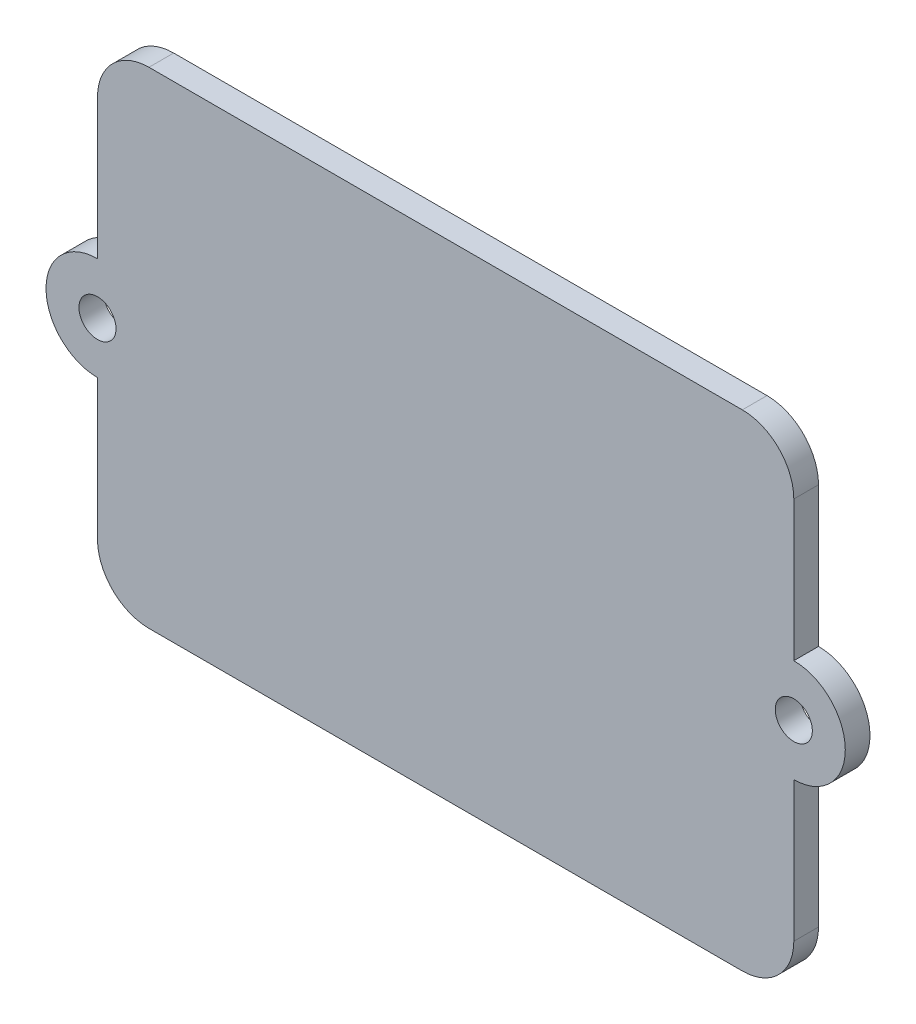
ISO-10303-21;
HEADER;
FILE_DESCRIPTION(('STEP AP214'),'2;1');
FILE_NAME('part.step','',(''),(''),'','','');
FILE_SCHEMA(('AUTOMOTIVE_DESIGN { 1 0 10303 214 1 1 1 1 }'));
ENDSEC;
DATA;
#1=APPLICATION_CONTEXT('core data for automotive mechanical design processes');
#2=APPLICATION_PROTOCOL_DEFINITION('international standard','automotive_design',2000,#1);
#3=PRODUCT_CONTEXT('',#1,'mechanical');
#4=PRODUCT('Part','Part','',(#3));
#5=PRODUCT_RELATED_PRODUCT_CATEGORY('part','',(#4));
#6=PRODUCT_DEFINITION_FORMATION('','',#4);
#7=PRODUCT_DEFINITION_CONTEXT('part definition',#1,'design');
#8=PRODUCT_DEFINITION('design','',#6,#7);
#9=PRODUCT_DEFINITION_SHAPE('','',#8);
#10=(LENGTH_UNIT() NAMED_UNIT(*) SI_UNIT(.MILLI.,.METRE.));
#11=(NAMED_UNIT(*) PLANE_ANGLE_UNIT() SI_UNIT($,.RADIAN.));
#12=(NAMED_UNIT(*) SI_UNIT($,.STERADIAN.) SOLID_ANGLE_UNIT());
#13=UNCERTAINTY_MEASURE_WITH_UNIT(LENGTH_MEASURE(1.E-05),#10,'distance_accuracy_value','');
#14=(GEOMETRIC_REPRESENTATION_CONTEXT(3) GLOBAL_UNCERTAINTY_ASSIGNED_CONTEXT((#13)) GLOBAL_UNIT_ASSIGNED_CONTEXT((#10,
#11,#12)) REPRESENTATION_CONTEXT('',''));
#15=CARTESIAN_POINT('',(0.,0.,0.));
#16=DIRECTION('',(0.,0.,1.));
#17=DIRECTION('',(1.,0.,0.));
#18=AXIS2_PLACEMENT_3D('',#15,#16,#17);
#19=CARTESIAN_POINT('',(42.9449992,0.,1.524));
#20=DIRECTION('',(-1.,0.,0.));
#21=DIRECTION('',(0.,0.,1.));
#22=AXIS2_PLACEMENT_3D('',#19,#20,#21);
#23=PLANE('',#22);
#24=DIRECTION('',(0.,1.,0.));
#25=VECTOR('',#24,1.);
#26=CARTESIAN_POINT('',(42.9449992,0.,1.524));
#27=LINE('',#26,#25);
#28=CARTESIAN_POINT('',(42.9449992,3.175,1.524));
#29=VERTEX_POINT('',#28);
#30=CARTESIAN_POINT('',(42.9449992,11.811,1.524));
#31=VERTEX_POINT('',#30);
#32=EDGE_CURVE('E150',#29,#31,#27,.T.);
#33=ORIENTED_EDGE('',*,*,#32,.F.);
#34=DIRECTION('',(0.,0.,-1.));
#35=VECTOR('',#34,1.);
#36=CARTESIAN_POINT('',(42.9449992,3.175,1.524));
#37=LINE('',#36,#35);
#38=CARTESIAN_POINT('',(42.9449992,3.175,0.));
#39=VERTEX_POINT('',#38);
#40=EDGE_CURVE('E221',#29,#39,#37,.T.);
#41=ORIENTED_EDGE('',*,*,#40,.T.);
#42=DIRECTION('',(0.,1.,0.));
#43=VECTOR('',#42,1.);
#44=CARTESIAN_POINT('',(42.9449992,0.,0.));
#45=LINE('',#44,#43);
#46=CARTESIAN_POINT('',(42.9449992,11.811,0.));
#47=VERTEX_POINT('',#46);
#48=EDGE_CURVE('E178',#39,#47,#45,.T.);
#49=ORIENTED_EDGE('',*,*,#48,.T.);
#50=DIRECTION('',(0.,0.,1.));
#51=VECTOR('',#50,1.);
#52=CARTESIAN_POINT('',(42.9449992,11.811,-8.98025612106916));
#53=LINE('',#52,#51);
#54=EDGE_CURVE('E142',#47,#31,#53,.T.);
#55=ORIENTED_EDGE('',*,*,#54,.T.);
#56=EDGE_LOOP('',(#33,#41,#49,#55));
#57=FACE_BOUND('',#56,.T.);
#58=ADVANCED_FACE('F39',(#57),#23,.F.);
#59=CARTESIAN_POINT('',(0.,0.,1.524));
#60=DIRECTION('',(1.,0.,0.));
#61=DIRECTION('',(0.,0.,-1.));
#62=AXIS2_PLACEMENT_3D('',#59,#60,#61);
#63=PLANE('',#62);
#64=DIRECTION('',(0.,-1.,0.));
#65=VECTOR('',#64,1.);
#66=CARTESIAN_POINT('',(0.,0.,1.524));
#67=LINE('',#66,#65);
#68=CARTESIAN_POINT('',(0.,26.797,1.524));
#69=VERTEX_POINT('',#68);
#70=CARTESIAN_POINT('',(0.,18.161,1.524));
#71=VERTEX_POINT('',#70);
#72=EDGE_CURVE('E163',#69,#71,#67,.T.);
#73=ORIENTED_EDGE('',*,*,#72,.F.);
#74=DIRECTION('',(0.,0.,-1.));
#75=VECTOR('',#74,1.);
#76=CARTESIAN_POINT('',(0.,26.797,1.524));
#77=LINE('',#76,#75);
#78=CARTESIAN_POINT('',(0.,26.797,0.));
#79=VERTEX_POINT('',#78);
#80=EDGE_CURVE('E169',#69,#79,#77,.T.);
#81=ORIENTED_EDGE('',*,*,#80,.T.);
#82=DIRECTION('',(0.,-1.,0.));
#83=VECTOR('',#82,1.);
#84=CARTESIAN_POINT('',(0.,0.,0.));
#85=LINE('',#84,#83);
#86=CARTESIAN_POINT('',(0.,18.161,0.));
#87=VERTEX_POINT('',#86);
#88=EDGE_CURVE('E170',#79,#87,#85,.T.);
#89=ORIENTED_EDGE('',*,*,#88,.T.);
#90=DIRECTION('',(0.,0.,1.));
#91=VECTOR('',#90,1.);
#92=CARTESIAN_POINT('',(0.,18.161,-8.98025612106916));
#93=LINE('',#92,#91);
#94=EDGE_CURVE('E259',#87,#71,#93,.T.);
#95=ORIENTED_EDGE('',*,*,#94,.T.);
#96=EDGE_LOOP('',(#73,#81,#89,#95));
#97=FACE_BOUND('',#96,.T.);
#98=ADVANCED_FACE('F286',(#97),#63,.F.);
#99=CARTESIAN_POINT('',(0.,11.811,0.));
#100=VERTEX_POINT('',#99);
#101=CARTESIAN_POINT('',(0.,3.175,0.));
#102=VERTEX_POINT('',#101);
#103=EDGE_CURVE('E174',#100,#102,#85,.T.);
#104=ORIENTED_EDGE('',*,*,#103,.T.);
#105=DIRECTION('',(0.,0.,-1.));
#106=VECTOR('',#105,1.);
#107=CARTESIAN_POINT('',(0.,3.175,1.524));
#108=LINE('',#107,#106);
#109=CARTESIAN_POINT('',(0.,3.175,1.524));
#110=VERTEX_POINT('',#109);
#111=EDGE_CURVE('E11',#102,#110,#108,.F.);
#112=ORIENTED_EDGE('',*,*,#111,.T.);
#113=CARTESIAN_POINT('',(0.,11.811,1.524));
#114=VERTEX_POINT('',#113);
#115=EDGE_CURVE('E185',#114,#110,#67,.T.);
#116=ORIENTED_EDGE('',*,*,#115,.F.);
#117=DIRECTION('',(0.,0.,1.));
#118=VECTOR('',#117,1.);
#119=CARTESIAN_POINT('',(0.,11.811,-8.98025612106916));
#120=LINE('',#119,#118);
#121=EDGE_CURVE('E255',#114,#100,#120,.F.);
#122=ORIENTED_EDGE('',*,*,#121,.T.);
#123=EDGE_LOOP('',(#104,#112,#116,#122));
#124=FACE_BOUND('',#123,.T.);
#125=ADVANCED_FACE('F269',(#124),#63,.F.);
#126=CARTESIAN_POINT('',(0.,0.,1.524));
#127=DIRECTION('',(0.,1.,0.));
#128=DIRECTION('',(0.,0.,1.));
#129=AXIS2_PLACEMENT_3D('',#126,#127,#128);
#130=PLANE('',#129);
#131=DIRECTION('',(1.,0.,0.));
#132=VECTOR('',#131,1.);
#133=CARTESIAN_POINT('',(0.,0.,0.));
#134=LINE('',#133,#132);
#135=CARTESIAN_POINT('',(3.175,0.,0.));
#136=VERTEX_POINT('',#135);
#137=CARTESIAN_POINT('',(39.7699992,0.,0.));
#138=VERTEX_POINT('',#137);
#139=EDGE_CURVE('E173',#136,#138,#134,.T.);
#140=ORIENTED_EDGE('',*,*,#139,.T.);
#141=DIRECTION('',(0.,0.,-1.));
#142=VECTOR('',#141,1.);
#143=CARTESIAN_POINT('',(39.7699992,0.,1.524));
#144=LINE('',#143,#142);
#145=CARTESIAN_POINT('',(39.7699992,0.,1.524));
#146=VERTEX_POINT('',#145);
#147=EDGE_CURVE('E48',#138,#146,#144,.F.);
#148=ORIENTED_EDGE('',*,*,#147,.T.);
#149=DIRECTION('',(1.,0.,0.));
#150=VECTOR('',#149,1.);
#151=CARTESIAN_POINT('',(0.,0.,1.524));
#152=LINE('',#151,#150);
#153=CARTESIAN_POINT('',(3.175,0.,1.524));
#154=VERTEX_POINT('',#153);
#155=EDGE_CURVE('E158',#154,#146,#152,.T.);
#156=ORIENTED_EDGE('',*,*,#155,.F.);
#157=DIRECTION('',(0.,0.,-1.));
#158=VECTOR('',#157,1.);
#159=CARTESIAN_POINT('',(3.175,0.,1.524));
#160=LINE('',#159,#158);
#161=EDGE_CURVE('E225',#154,#136,#160,.T.);
#162=ORIENTED_EDGE('',*,*,#161,.T.);
#163=EDGE_LOOP('',(#140,#148,#156,#162));
#164=FACE_BOUND('',#163,.T.);
#165=ADVANCED_FACE('F231',(#164),#130,.F.);
#166=CARTESIAN_POINT('',(42.9449992,18.161,0.));
#167=VERTEX_POINT('',#166);
#168=CARTESIAN_POINT('',(42.9449992,26.797,0.));
#169=VERTEX_POINT('',#168);
#170=EDGE_CURVE('E177',#167,#169,#45,.T.);
#171=ORIENTED_EDGE('',*,*,#170,.T.);
#172=DIRECTION('',(0.,0.,-1.));
#173=VECTOR('',#172,1.);
#174=CARTESIAN_POINT('',(42.9449992,26.797,1.524));
#175=LINE('',#174,#173);
#176=CARTESIAN_POINT('',(42.9449992,26.797,1.524));
#177=VERTEX_POINT('',#176);
#178=EDGE_CURVE('E156',#169,#177,#175,.F.);
#179=ORIENTED_EDGE('',*,*,#178,.T.);
#180=CARTESIAN_POINT('',(42.9449992,18.161,1.524));
#181=VERTEX_POINT('',#180);
#182=EDGE_CURVE('E147',#181,#177,#27,.T.);
#183=ORIENTED_EDGE('',*,*,#182,.F.);
#184=DIRECTION('',(0.,0.,1.));
#185=VECTOR('',#184,1.);
#186=CARTESIAN_POINT('',(42.9449992,18.161,-8.98025612106916));
#187=LINE('',#186,#185);
#188=EDGE_CURVE('E129',#181,#167,#187,.F.);
#189=ORIENTED_EDGE('',*,*,#188,.T.);
#190=EDGE_LOOP('',(#171,#179,#183,#189));
#191=FACE_BOUND('',#190,.T.);
#192=ADVANCED_FACE('F154',(#191),#23,.F.);
#193=CARTESIAN_POINT('',(0.,29.972,1.524));
#194=DIRECTION('',(0.,-1.,0.));
#195=DIRECTION('',(0.,0.,-1.));
#196=AXIS2_PLACEMENT_3D('',#193,#194,#195);
#197=PLANE('',#196);
#198=DIRECTION('',(-1.,0.,0.));
#199=VECTOR('',#198,1.);
#200=CARTESIAN_POINT('',(0.,29.972,0.));
#201=LINE('',#200,#199);
#202=CARTESIAN_POINT('',(39.7699992,29.972,0.));
#203=VERTEX_POINT('',#202);
#204=CARTESIAN_POINT('',(3.175,29.972,0.));
#205=VERTEX_POINT('',#204);
#206=EDGE_CURVE('E181',#203,#205,#201,.T.);
#207=ORIENTED_EDGE('',*,*,#206,.T.);
#208=DIRECTION('',(0.,0.,-1.));
#209=VECTOR('',#208,1.);
#210=CARTESIAN_POINT('',(3.175,29.972,1.524));
#211=LINE('',#210,#209);
#212=CARTESIAN_POINT('',(3.175,29.972,1.524));
#213=VERTEX_POINT('',#212);
#214=EDGE_CURVE('E205',#205,#213,#211,.F.);
#215=ORIENTED_EDGE('',*,*,#214,.T.);
#216=DIRECTION('',(-1.,0.,0.));
#217=VECTOR('',#216,1.);
#218=CARTESIAN_POINT('',(0.,29.972,1.524));
#219=LINE('',#218,#217);
#220=CARTESIAN_POINT('',(39.7699992,29.972,1.524));
#221=VERTEX_POINT('',#220);
#222=EDGE_CURVE('E162',#221,#213,#219,.T.);
#223=ORIENTED_EDGE('',*,*,#222,.F.);
#224=DIRECTION('',(0.,0.,-1.));
#225=VECTOR('',#224,1.);
#226=CARTESIAN_POINT('',(39.7699992,29.972,1.524));
#227=LINE('',#226,#225);
#228=EDGE_CURVE('E201',#221,#203,#227,.T.);
#229=ORIENTED_EDGE('',*,*,#228,.T.);
#230=EDGE_LOOP('',(#207,#215,#223,#229));
#231=FACE_BOUND('',#230,.T.);
#232=ADVANCED_FACE('F279',(#231),#197,.F.);
#233=CARTESIAN_POINT('',(0.,0.,1.524));
#234=DIRECTION('',(0.,0.,-1.));
#235=DIRECTION('',(-1.,0.,0.));
#236=AXIS2_PLACEMENT_3D('',#233,#234,#235);
#237=PLANE('',#236);
#238=CARTESIAN_POINT('',(0.,14.986,1.524));
#239=DIRECTION('',(0.,0.,1.));
#240=DIRECTION('',(1.,0.,0.));
#241=AXIS2_PLACEMENT_3D('',#238,#239,#240);
#242=CIRCLE('',#241,1.143);
#243=CARTESIAN_POINT('',(1.143,14.986,1.524));
#244=VERTEX_POINT('',#243);
#245=EDGE_CURVE('E435',#244,#244,#242,.T.);
#246=ORIENTED_EDGE('',*,*,#245,.F.);
#247=EDGE_LOOP('',(#246));
#248=FACE_BOUND('',#247,.T.);
#249=CARTESIAN_POINT('',(42.9449992,14.986,1.524));
#250=DIRECTION('',(0.,0.,1.));
#251=DIRECTION('',(1.,0.,0.));
#252=AXIS2_PLACEMENT_3D('',#249,#250,#251);
#253=CIRCLE('',#252,1.143);
#254=CARTESIAN_POINT('',(44.0879992,14.986,1.524));
#255=VERTEX_POINT('',#254);
#256=EDGE_CURVE('E430',#255,#255,#253,.T.);
#257=ORIENTED_EDGE('',*,*,#256,.F.);
#258=EDGE_LOOP('',(#257));
#259=FACE_BOUND('',#258,.T.);
#260=ORIENTED_EDGE('',*,*,#222,.T.);
#261=CARTESIAN_POINT('',(3.175,26.797,1.524));
#262=DIRECTION('',(0.,0.,-1.));
#263=DIRECTION('',(-1.,0.,0.));
#264=AXIS2_PLACEMENT_3D('',#261,#262,#263);
#265=CIRCLE('',#264,3.175);
#266=EDGE_CURVE('E216',#213,#69,#265,.F.);
#267=ORIENTED_EDGE('',*,*,#266,.T.);
#268=ORIENTED_EDGE('',*,*,#72,.T.);
#269=CARTESIAN_POINT('',(0.,14.986,1.524));
#270=DIRECTION('',(0.,0.,1.));
#271=DIRECTION('',(1.,0.,0.));
#272=AXIS2_PLACEMENT_3D('',#269,#270,#271);
#273=CIRCLE('',#272,3.175);
#274=EDGE_CURVE('E245',#71,#114,#273,.T.);
#275=ORIENTED_EDGE('',*,*,#274,.T.);
#276=ORIENTED_EDGE('',*,*,#115,.T.);
#277=CARTESIAN_POINT('',(3.175,3.175,1.524));
#278=DIRECTION('',(0.,0.,-1.));
#279=DIRECTION('',(-1.,0.,0.));
#280=AXIS2_PLACEMENT_3D('',#277,#278,#279);
#281=CIRCLE('',#280,3.175);
#282=EDGE_CURVE('E61',#110,#154,#281,.F.);
#283=ORIENTED_EDGE('',*,*,#282,.T.);
#284=ORIENTED_EDGE('',*,*,#155,.T.);
#285=CARTESIAN_POINT('',(39.7699992,3.175,1.524));
#286=DIRECTION('',(0.,0.,-1.));
#287=DIRECTION('',(-1.,0.,0.));
#288=AXIS2_PLACEMENT_3D('',#285,#286,#287);
#289=CIRCLE('',#288,3.175);
#290=EDGE_CURVE('E210',#146,#29,#289,.F.);
#291=ORIENTED_EDGE('',*,*,#290,.T.);
#292=ORIENTED_EDGE('',*,*,#32,.T.);
#293=CARTESIAN_POINT('',(42.9449992,14.986,1.524));
#294=DIRECTION('',(0.,0.,1.));
#295=DIRECTION('',(1.,0.,0.));
#296=AXIS2_PLACEMENT_3D('',#293,#294,#295);
#297=CIRCLE('',#296,3.175);
#298=EDGE_CURVE('E133',#31,#181,#297,.T.);
#299=ORIENTED_EDGE('',*,*,#298,.T.);
#300=ORIENTED_EDGE('',*,*,#182,.T.);
#301=CARTESIAN_POINT('',(39.7699992,26.797,1.524));
#302=DIRECTION('',(0.,0.,-1.));
#303=DIRECTION('',(-1.,0.,0.));
#304=AXIS2_PLACEMENT_3D('',#301,#302,#303);
#305=CIRCLE('',#304,3.175);
#306=EDGE_CURVE('E213',#177,#221,#305,.F.);
#307=ORIENTED_EDGE('',*,*,#306,.T.);
#308=EDGE_LOOP('',(#260,#267,#268,#275,#276,#283,#284,#291,#292,#299,#300,#307));
#309=FACE_BOUND('',#308,.T.);
#310=ADVANCED_FACE('F146',(#248,#259,#309),#237,.F.);
#311=CARTESIAN_POINT('',(0.,0.,0.));
#312=DIRECTION('',(0.,0.,-1.));
#313=DIRECTION('',(-1.,0.,0.));
#314=AXIS2_PLACEMENT_3D('',#311,#312,#313);
#315=PLANE('',#314);
#316=CARTESIAN_POINT('',(0.,14.986,0.));
#317=DIRECTION('',(0.,0.,1.));
#318=DIRECTION('',(1.,0.,0.));
#319=AXIS2_PLACEMENT_3D('',#316,#317,#318);
#320=CIRCLE('',#319,1.143);
#321=CARTESIAN_POINT('',(1.143,14.986,0.));
#322=VERTEX_POINT('',#321);
#323=EDGE_CURVE('E152',#322,#322,#320,.T.);
#324=ORIENTED_EDGE('',*,*,#323,.T.);
#325=EDGE_LOOP('',(#324));
#326=FACE_BOUND('',#325,.T.);
#327=CARTESIAN_POINT('',(42.9449992,14.986,0.));
#328=DIRECTION('',(0.,0.,1.));
#329=DIRECTION('',(1.,0.,0.));
#330=AXIS2_PLACEMENT_3D('',#327,#328,#329);
#331=CIRCLE('',#330,1.143);
#332=CARTESIAN_POINT('',(44.0879992,14.986,0.));
#333=VERTEX_POINT('',#332);
#334=EDGE_CURVE('E427',#333,#333,#331,.T.);
#335=ORIENTED_EDGE('',*,*,#334,.T.);
#336=EDGE_LOOP('',(#335));
#337=FACE_BOUND('',#336,.T.);
#338=ORIENTED_EDGE('',*,*,#88,.F.);
#339=CARTESIAN_POINT('',(3.175,26.797,0.));
#340=DIRECTION('',(0.,0.,-1.));
#341=DIRECTION('',(-1.,0.,0.));
#342=AXIS2_PLACEMENT_3D('',#339,#340,#341);
#343=CIRCLE('',#342,3.175);
#344=EDGE_CURVE('E198',#79,#205,#343,.T.);
#345=ORIENTED_EDGE('',*,*,#344,.T.);
#346=ORIENTED_EDGE('',*,*,#206,.F.);
#347=CARTESIAN_POINT('',(39.7699992,26.797,0.));
#348=DIRECTION('',(0.,0.,-1.));
#349=DIRECTION('',(-1.,0.,0.));
#350=AXIS2_PLACEMENT_3D('',#347,#348,#349);
#351=CIRCLE('',#350,3.175);
#352=EDGE_CURVE('E195',#203,#169,#351,.T.);
#353=ORIENTED_EDGE('',*,*,#352,.T.);
#354=ORIENTED_EDGE('',*,*,#170,.F.);
#355=CARTESIAN_POINT('',(42.9449992,14.986,0.));
#356=DIRECTION('',(0.,0.,-1.));
#357=DIRECTION('',(-1.,0.,0.));
#358=AXIS2_PLACEMENT_3D('',#355,#356,#357);
#359=CIRCLE('',#358,3.175);
#360=EDGE_CURVE('E136',#47,#167,#359,.F.);
#361=ORIENTED_EDGE('',*,*,#360,.F.);
#362=ORIENTED_EDGE('',*,*,#48,.F.);
#363=CARTESIAN_POINT('',(39.7699992,3.175,0.));
#364=DIRECTION('',(0.,0.,-1.));
#365=DIRECTION('',(-1.,0.,0.));
#366=AXIS2_PLACEMENT_3D('',#363,#364,#365);
#367=CIRCLE('',#366,3.175);
#368=EDGE_CURVE('E192',#39,#138,#367,.T.);
#369=ORIENTED_EDGE('',*,*,#368,.T.);
#370=ORIENTED_EDGE('',*,*,#139,.F.);
#371=CARTESIAN_POINT('',(3.175,3.175,0.));
#372=DIRECTION('',(0.,0.,-1.));
#373=DIRECTION('',(-1.,0.,0.));
#374=AXIS2_PLACEMENT_3D('',#371,#372,#373);
#375=CIRCLE('',#374,3.175);
#376=EDGE_CURVE('E189',#136,#102,#375,.T.);
#377=ORIENTED_EDGE('',*,*,#376,.T.);
#378=ORIENTED_EDGE('',*,*,#103,.F.);
#379=CARTESIAN_POINT('',(0.,14.986,0.));
#380=DIRECTION('',(0.,0.,-1.));
#381=DIRECTION('',(-1.,0.,0.));
#382=AXIS2_PLACEMENT_3D('',#379,#380,#381);
#383=CIRCLE('',#382,3.175);
#384=EDGE_CURVE('E249',#87,#100,#383,.F.);
#385=ORIENTED_EDGE('',*,*,#384,.F.);
#386=EDGE_LOOP('',(#338,#345,#346,#353,#354,#361,#362,#369,#370,#377,#378,#385));
#387=FACE_BOUND('',#386,.T.);
#388=ADVANCED_FACE('F235',(#326,#337,#387),#315,.T.);
#389=CARTESIAN_POINT('',(0.,14.986,-8.98025612106916));
#390=DIRECTION('',(0.,0.,1.));
#391=DIRECTION('',(1.,0.,0.));
#392=AXIS2_PLACEMENT_3D('',#389,#390,#391);
#393=CYLINDRICAL_SURFACE('',#392,3.175);
#394=ORIENTED_EDGE('',*,*,#94,.F.);
#395=ORIENTED_EDGE('',*,*,#384,.T.);
#396=ORIENTED_EDGE('',*,*,#121,.F.);
#397=ORIENTED_EDGE('',*,*,#274,.F.);
#398=EDGE_LOOP('',(#394,#395,#396,#397));
#399=FACE_BOUND('',#398,.T.);
#400=ADVANCED_FACE('F289',(#399),#393,.T.);
#401=CARTESIAN_POINT('',(42.9449992,14.986,-8.98025612106916));
#402=DIRECTION('',(0.,0.,1.));
#403=DIRECTION('',(1.,0.,0.));
#404=AXIS2_PLACEMENT_3D('',#401,#402,#403);
#405=CYLINDRICAL_SURFACE('',#404,3.175);
#406=ORIENTED_EDGE('',*,*,#54,.F.);
#407=ORIENTED_EDGE('',*,*,#360,.T.);
#408=ORIENTED_EDGE('',*,*,#188,.F.);
#409=ORIENTED_EDGE('',*,*,#298,.F.);
#410=EDGE_LOOP('',(#406,#407,#408,#409));
#411=FACE_BOUND('',#410,.T.);
#412=ADVANCED_FACE('F132',(#411),#405,.T.);
#413=CARTESIAN_POINT('',(42.9449992,14.986,0.));
#414=DIRECTION('',(0.,0.,1.));
#415=DIRECTION('',(1.,0.,0.));
#416=AXIS2_PLACEMENT_3D('',#413,#414,#415);
#417=CYLINDRICAL_SURFACE('',#416,1.143);
#418=CARTESIAN_POINT('',(44.0879992,14.986,0.));
#419=CARTESIAN_POINT('',(44.0879992,14.986,0.015875));
#420=CARTESIAN_POINT('',(44.0879992,14.986,0.03175));
#421=CARTESIAN_POINT('',(44.0879992,14.986,0.0635));
#422=CARTESIAN_POINT('',(44.0879992,14.986,0.079375));
#423=CARTESIAN_POINT('',(44.0879992,14.986,0.111125));
#424=CARTESIAN_POINT('',(44.0879992,14.986,0.127));
#425=CARTESIAN_POINT('',(44.0879992,14.986,0.15875));
#426=CARTESIAN_POINT('',(44.0879992,14.986,0.174625));
#427=CARTESIAN_POINT('',(44.0879992,14.986,0.206375));
#428=CARTESIAN_POINT('',(44.0879992,14.986,0.22225));
#429=CARTESIAN_POINT('',(44.0879992,14.986,0.254));
#430=CARTESIAN_POINT('',(44.0879992,14.986,0.269875));
#431=CARTESIAN_POINT('',(44.0879992,14.986,0.301625));
#432=CARTESIAN_POINT('',(44.0879992,14.986,0.3175));
#433=CARTESIAN_POINT('',(44.0879992,14.986,0.34925));
#434=CARTESIAN_POINT('',(44.0879992,14.986,0.365125));
#435=CARTESIAN_POINT('',(44.0879992,14.986,0.396875));
#436=CARTESIAN_POINT('',(44.0879992,14.986,0.41275));
#437=CARTESIAN_POINT('',(44.0879992,14.986,0.4445));
#438=CARTESIAN_POINT('',(44.0879992,14.986,0.460375));
#439=CARTESIAN_POINT('',(44.0879992,14.986,0.492125));
#440=CARTESIAN_POINT('',(44.0879992,14.986,0.508));
#441=CARTESIAN_POINT('',(44.0879992,14.986,0.53975));
#442=CARTESIAN_POINT('',(44.0879992,14.986,0.555625));
#443=CARTESIAN_POINT('',(44.0879992,14.986,0.587375));
#444=CARTESIAN_POINT('',(44.0879992,14.986,0.60325));
#445=CARTESIAN_POINT('',(44.0879992,14.986,0.635));
#446=CARTESIAN_POINT('',(44.0879992,14.986,0.650875));
#447=CARTESIAN_POINT('',(44.0879992,14.986,0.682625));
#448=CARTESIAN_POINT('',(44.0879992,14.986,0.6985));
#449=CARTESIAN_POINT('',(44.0879992,14.986,0.73025));
#450=CARTESIAN_POINT('',(44.0879992,14.986,0.746125));
#451=CARTESIAN_POINT('',(44.0879992,14.986,0.777875));
#452=CARTESIAN_POINT('',(44.0879992,14.986,0.79375));
#453=CARTESIAN_POINT('',(44.0879992,14.986,0.8255));
#454=CARTESIAN_POINT('',(44.0879992,14.986,0.841375));
#455=CARTESIAN_POINT('',(44.0879992,14.986,0.873125));
#456=CARTESIAN_POINT('',(44.0879992,14.986,0.889));
#457=CARTESIAN_POINT('',(44.0879992,14.986,0.92075));
#458=CARTESIAN_POINT('',(44.0879992,14.986,0.936625));
#459=CARTESIAN_POINT('',(44.0879992,14.986,0.968375));
#460=CARTESIAN_POINT('',(44.0879992,14.986,0.98425));
#461=CARTESIAN_POINT('',(44.0879992,14.986,1.016));
#462=CARTESIAN_POINT('',(44.0879992,14.986,1.031875));
#463=CARTESIAN_POINT('',(44.0879992,14.986,1.063625));
#464=CARTESIAN_POINT('',(44.0879992,14.986,1.0795));
#465=CARTESIAN_POINT('',(44.0879992,14.986,1.11125));
#466=CARTESIAN_POINT('',(44.0879992,14.986,1.127125));
#467=CARTESIAN_POINT('',(44.0879992,14.986,1.158875));
#468=CARTESIAN_POINT('',(44.0879992,14.986,1.17475));
#469=CARTESIAN_POINT('',(44.0879992,14.986,1.2065));
#470=CARTESIAN_POINT('',(44.0879992,14.986,1.222375));
#471=CARTESIAN_POINT('',(44.0879992,14.986,1.254125));
#472=CARTESIAN_POINT('',(44.0879992,14.986,1.27));
#473=CARTESIAN_POINT('',(44.0879992,14.986,1.30175));
#474=CARTESIAN_POINT('',(44.0879992,14.986,1.317625));
#475=CARTESIAN_POINT('',(44.0879992,14.986,1.349375));
#476=CARTESIAN_POINT('',(44.0879992,14.986,1.36525));
#477=CARTESIAN_POINT('',(44.0879992,14.986,1.397));
#478=CARTESIAN_POINT('',(44.0879992,14.986,1.412875));
#479=CARTESIAN_POINT('',(44.0879992,14.986,1.444625));
#480=CARTESIAN_POINT('',(44.0879992,14.986,1.4605));
#481=CARTESIAN_POINT('',(44.0879992,14.986,1.49225));
#482=CARTESIAN_POINT('',(44.0879992,14.986,1.508125));
#483=CARTESIAN_POINT('',(44.0879992,14.986,1.524));
#484=B_SPLINE_CURVE_WITH_KNOTS('',3,(#418,#419,#420,#421,#422,#423,#424,#425,#426,#427,#428,
#429,#430,#431,#432,#433,#434,#435,#436,#437,#438,#439,#440,#441,#442,#443,#444,#445,#446,#447,
#448,#449,#450,#451,#452,#453,#454,#455,#456,#457,#458,#459,#460,#461,#462,#463,#464,#465,#466,
#467,#468,#469,#470,#471,#472,#473,#474,#475,#476,#477,#478,#479,#480,#481,#482,#483),
.UNSPECIFIED.,.F.,.F.,(4,2,2,2,2,2,2,2,2,2,2,2,2,2,2,2,2,2,2,2,2,2,2,2,2,2,2,2,2,2,2,2,4),(0.,
0.047625,0.09525,0.142875,0.1905,0.238125,0.28575,0.333375,0.381,0.428625,0.47625,0.523875,
0.5715,0.619125,0.66675,0.714375,0.762,0.809625,0.85725,0.904875,0.9525,1.000125,1.04775,
1.095375,1.143,1.190625,1.23825,1.285875,1.3335,1.381125,1.42875,1.476375,1.524),.UNSPECIFIED.);
#485=EDGE_CURVE('BSEAM296',#333,#255,#484,.T.);
#486=ORIENTED_EDGE('',*,*,#334,.F.);
#487=ORIENTED_EDGE('',*,*,#256,.T.);
#488=ORIENTED_EDGE('',*,*,#485,.T.);
#489=ORIENTED_EDGE('',*,*,#485,.F.);
#490=EDGE_LOOP('',(#486,#488,#487,#489));
#491=FACE_BOUND('',#490,.T.);
#492=ADVANCED_FACE('F296',(#491),#417,.F.);
#493=CARTESIAN_POINT('',(0.,14.986,0.));
#494=DIRECTION('',(0.,0.,1.));
#495=DIRECTION('',(1.,0.,0.));
#496=AXIS2_PLACEMENT_3D('',#493,#494,#495);
#497=CYLINDRICAL_SURFACE('',#496,1.143);
#498=CARTESIAN_POINT('',(1.143,14.986,0.));
#499=CARTESIAN_POINT('',(1.143,14.986,0.015875));
#500=CARTESIAN_POINT('',(1.143,14.986,0.03175));
#501=CARTESIAN_POINT('',(1.143,14.986,0.0635));
#502=CARTESIAN_POINT('',(1.143,14.986,0.079375));
#503=CARTESIAN_POINT('',(1.143,14.986,0.111125));
#504=CARTESIAN_POINT('',(1.143,14.986,0.127));
#505=CARTESIAN_POINT('',(1.143,14.986,0.15875));
#506=CARTESIAN_POINT('',(1.143,14.986,0.174625));
#507=CARTESIAN_POINT('',(1.143,14.986,0.206375));
#508=CARTESIAN_POINT('',(1.143,14.986,0.22225));
#509=CARTESIAN_POINT('',(1.143,14.986,0.254));
#510=CARTESIAN_POINT('',(1.143,14.986,0.269875));
#511=CARTESIAN_POINT('',(1.143,14.986,0.301625));
#512=CARTESIAN_POINT('',(1.143,14.986,0.3175));
#513=CARTESIAN_POINT('',(1.143,14.986,0.34925));
#514=CARTESIAN_POINT('',(1.143,14.986,0.365125));
#515=CARTESIAN_POINT('',(1.143,14.986,0.396875));
#516=CARTESIAN_POINT('',(1.143,14.986,0.41275));
#517=CARTESIAN_POINT('',(1.143,14.986,0.4445));
#518=CARTESIAN_POINT('',(1.143,14.986,0.460375));
#519=CARTESIAN_POINT('',(1.143,14.986,0.492125));
#520=CARTESIAN_POINT('',(1.143,14.986,0.508));
#521=CARTESIAN_POINT('',(1.143,14.986,0.53975));
#522=CARTESIAN_POINT('',(1.143,14.986,0.555625));
#523=CARTESIAN_POINT('',(1.143,14.986,0.587375));
#524=CARTESIAN_POINT('',(1.143,14.986,0.60325));
#525=CARTESIAN_POINT('',(1.143,14.986,0.635));
#526=CARTESIAN_POINT('',(1.143,14.986,0.650875));
#527=CARTESIAN_POINT('',(1.143,14.986,0.682625));
#528=CARTESIAN_POINT('',(1.143,14.986,0.6985));
#529=CARTESIAN_POINT('',(1.143,14.986,0.73025));
#530=CARTESIAN_POINT('',(1.143,14.986,0.746125));
#531=CARTESIAN_POINT('',(1.143,14.986,0.777875));
#532=CARTESIAN_POINT('',(1.143,14.986,0.79375));
#533=CARTESIAN_POINT('',(1.143,14.986,0.8255));
#534=CARTESIAN_POINT('',(1.143,14.986,0.841375));
#535=CARTESIAN_POINT('',(1.143,14.986,0.873125));
#536=CARTESIAN_POINT('',(1.143,14.986,0.889));
#537=CARTESIAN_POINT('',(1.143,14.986,0.92075));
#538=CARTESIAN_POINT('',(1.143,14.986,0.936625));
#539=CARTESIAN_POINT('',(1.143,14.986,0.968375));
#540=CARTESIAN_POINT('',(1.143,14.986,0.98425));
#541=CARTESIAN_POINT('',(1.143,14.986,1.016));
#542=CARTESIAN_POINT('',(1.143,14.986,1.031875));
#543=CARTESIAN_POINT('',(1.143,14.986,1.063625));
#544=CARTESIAN_POINT('',(1.143,14.986,1.0795));
#545=CARTESIAN_POINT('',(1.143,14.986,1.11125));
#546=CARTESIAN_POINT('',(1.143,14.986,1.127125));
#547=CARTESIAN_POINT('',(1.143,14.986,1.158875));
#548=CARTESIAN_POINT('',(1.143,14.986,1.17475));
#549=CARTESIAN_POINT('',(1.143,14.986,1.2065));
#550=CARTESIAN_POINT('',(1.143,14.986,1.222375));
#551=CARTESIAN_POINT('',(1.143,14.986,1.254125));
#552=CARTESIAN_POINT('',(1.143,14.986,1.27));
#553=CARTESIAN_POINT('',(1.143,14.986,1.30175));
#554=CARTESIAN_POINT('',(1.143,14.986,1.317625));
#555=CARTESIAN_POINT('',(1.143,14.986,1.349375));
#556=CARTESIAN_POINT('',(1.143,14.986,1.36525));
#557=CARTESIAN_POINT('',(1.143,14.986,1.397));
#558=CARTESIAN_POINT('',(1.143,14.986,1.412875));
#559=CARTESIAN_POINT('',(1.143,14.986,1.444625));
#560=CARTESIAN_POINT('',(1.143,14.986,1.4605));
#561=CARTESIAN_POINT('',(1.143,14.986,1.49225));
#562=CARTESIAN_POINT('',(1.143,14.986,1.508125));
#563=CARTESIAN_POINT('',(1.143,14.986,1.524));
#564=B_SPLINE_CURVE_WITH_KNOTS('',3,(#498,#499,#500,#501,#502,#503,#504,#505,#506,#507,#508,
#509,#510,#511,#512,#513,#514,#515,#516,#517,#518,#519,#520,#521,#522,#523,#524,#525,#526,#527,
#528,#529,#530,#531,#532,#533,#534,#535,#536,#537,#538,#539,#540,#541,#542,#543,#544,#545,#546,
#547,#548,#549,#550,#551,#552,#553,#554,#555,#556,#557,#558,#559,#560,#561,#562,#563),
.UNSPECIFIED.,.F.,.F.,(4,2,2,2,2,2,2,2,2,2,2,2,2,2,2,2,2,2,2,2,2,2,2,2,2,2,2,2,2,2,2,2,4),(0.,
0.047625,0.09525,0.142875,0.1905,0.238125,0.28575,0.333375,0.381,0.428625,0.47625,0.523875,
0.5715,0.619125,0.66675,0.714375,0.762,0.809625,0.85725,0.904875,0.9525,1.000125,1.04775,
1.095375,1.143,1.190625,1.23825,1.285875,1.3335,1.381125,1.42875,1.476375,1.524),.UNSPECIFIED.);
#565=EDGE_CURVE('BSEAM320',#322,#244,#564,.T.);
#566=ORIENTED_EDGE('',*,*,#323,.F.);
#567=ORIENTED_EDGE('',*,*,#245,.T.);
#568=ORIENTED_EDGE('',*,*,#565,.T.);
#569=ORIENTED_EDGE('',*,*,#565,.F.);
#570=EDGE_LOOP('',(#566,#568,#567,#569));
#571=FACE_BOUND('',#570,.T.);
#572=ADVANCED_FACE('F320',(#571),#497,.F.);
#573=CARTESIAN_POINT('',(3.175,26.797,1.524));
#574=DIRECTION('',(0.,0.,-1.));
#575=DIRECTION('',(-1.,0.,0.));
#576=AXIS2_PLACEMENT_3D('',#573,#574,#575);
#577=CYLINDRICAL_SURFACE('',#576,3.175);
#578=ORIENTED_EDGE('',*,*,#266,.F.);
#579=ORIENTED_EDGE('',*,*,#214,.F.);
#580=ORIENTED_EDGE('',*,*,#344,.F.);
#581=ORIENTED_EDGE('',*,*,#80,.F.);
#582=EDGE_LOOP('',(#578,#579,#580,#581));
#583=FACE_BOUND('',#582,.T.);
#584=ADVANCED_FACE('F283',(#583),#577,.T.);
#585=CARTESIAN_POINT('',(39.7699992,26.797,1.524));
#586=DIRECTION('',(0.,0.,-1.));
#587=DIRECTION('',(-1.,0.,0.));
#588=AXIS2_PLACEMENT_3D('',#585,#586,#587);
#589=CYLINDRICAL_SURFACE('',#588,3.175);
#590=ORIENTED_EDGE('',*,*,#306,.F.);
#591=ORIENTED_EDGE('',*,*,#178,.F.);
#592=ORIENTED_EDGE('',*,*,#352,.F.);
#593=ORIENTED_EDGE('',*,*,#228,.F.);
#594=EDGE_LOOP('',(#590,#591,#592,#593));
#595=FACE_BOUND('',#594,.T.);
#596=ADVANCED_FACE('F274',(#595),#589,.T.);
#597=CARTESIAN_POINT('',(39.7699992,3.175,1.524));
#598=DIRECTION('',(0.,0.,-1.));
#599=DIRECTION('',(-1.,0.,0.));
#600=AXIS2_PLACEMENT_3D('',#597,#598,#599);
#601=CYLINDRICAL_SURFACE('',#600,3.175);
#602=ORIENTED_EDGE('',*,*,#290,.F.);
#603=ORIENTED_EDGE('',*,*,#147,.F.);
#604=ORIENTED_EDGE('',*,*,#368,.F.);
#605=ORIENTED_EDGE('',*,*,#40,.F.);
#606=EDGE_LOOP('',(#602,#603,#604,#605));
#607=FACE_BOUND('',#606,.T.);
#608=ADVANCED_FACE('F242',(#607),#601,.T.);
#609=CARTESIAN_POINT('',(3.175,3.175,1.524));
#610=DIRECTION('',(0.,0.,-1.));
#611=DIRECTION('',(-1.,0.,0.));
#612=AXIS2_PLACEMENT_3D('',#609,#610,#611);
#613=CYLINDRICAL_SURFACE('',#612,3.175);
#614=ORIENTED_EDGE('',*,*,#282,.F.);
#615=ORIENTED_EDGE('',*,*,#111,.F.);
#616=ORIENTED_EDGE('',*,*,#376,.F.);
#617=ORIENTED_EDGE('',*,*,#161,.F.);
#618=EDGE_LOOP('',(#614,#615,#616,#617));
#619=FACE_BOUND('',#618,.T.);
#620=ADVANCED_FACE('F41',(#619),#613,.T.);
#621=CLOSED_SHELL('',(#58,#98,#125,#165,#192,#232,#310,#388,#400,#412,#492,#572,#584,#596,#608,#620));
#622=MANIFOLD_SOLID_BREP('B2',#621);
#623=ADVANCED_BREP_SHAPE_REPRESENTATION('',(#18,#622),#14);
#624=SHAPE_DEFINITION_REPRESENTATION(#9,#623);
ENDSEC;
END-ISO-10303-21;
